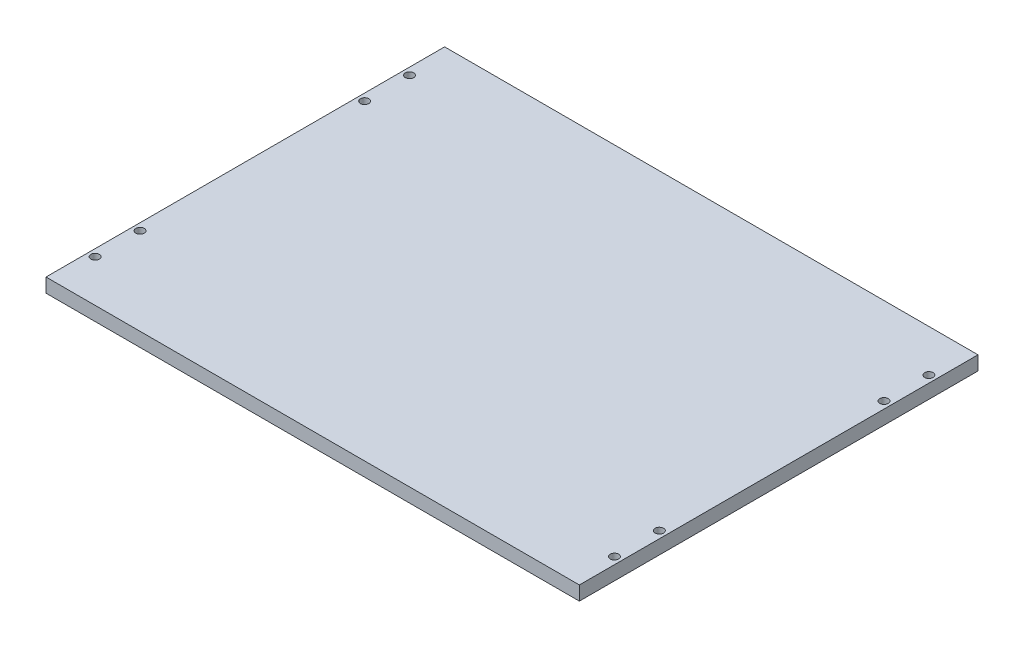
ISO-10303-21;
HEADER;
FILE_DESCRIPTION(('STEP AP214'),'2;1');
FILE_NAME('part.step','',(''),(''),'','','');
FILE_SCHEMA(('AUTOMOTIVE_DESIGN { 1 0 10303 214 1 1 1 1 }'));
ENDSEC;
DATA;
#1=APPLICATION_CONTEXT('core data for automotive mechanical design processes');
#2=APPLICATION_PROTOCOL_DEFINITION('international standard','automotive_design',2000,#1);
#3=PRODUCT_CONTEXT('',#1,'mechanical');
#4=PRODUCT('Part','Part','',(#3));
#5=PRODUCT_RELATED_PRODUCT_CATEGORY('part','',(#4));
#6=PRODUCT_DEFINITION_FORMATION('','',#4);
#7=PRODUCT_DEFINITION_CONTEXT('part definition',#1,'design');
#8=PRODUCT_DEFINITION('design','',#6,#7);
#9=PRODUCT_DEFINITION_SHAPE('','',#8);
#10=(LENGTH_UNIT() NAMED_UNIT(*) SI_UNIT(.MILLI.,.METRE.));
#11=(NAMED_UNIT(*) PLANE_ANGLE_UNIT() SI_UNIT($,.RADIAN.));
#12=(NAMED_UNIT(*) SI_UNIT($,.STERADIAN.) SOLID_ANGLE_UNIT());
#13=UNCERTAINTY_MEASURE_WITH_UNIT(LENGTH_MEASURE(1.E-05),#10,'distance_accuracy_value','');
#14=(GEOMETRIC_REPRESENTATION_CONTEXT(3) GLOBAL_UNCERTAINTY_ASSIGNED_CONTEXT((#13)) GLOBAL_UNIT_ASSIGNED_CONTEXT((#10,
#11,#12)) REPRESENTATION_CONTEXT('',''));
#15=CARTESIAN_POINT('',(0.,0.,0.));
#16=DIRECTION('',(0.,0.,1.));
#17=DIRECTION('',(1.,0.,0.));
#18=AXIS2_PLACEMENT_3D('',#15,#16,#17);
#19=CARTESIAN_POINT('',(0.,5.,0.));
#20=DIRECTION('',(0.,-1.,0.));
#21=DIRECTION('',(0.,0.,-1.));
#22=AXIS2_PLACEMENT_3D('',#19,#20,#21);
#23=PLANE('',#22);
#24=CARTESIAN_POINT('',(92.5,5.,-127.));
#25=DIRECTION('',(0.,1.,0.));
#26=DIRECTION('',(0.,0.,1.));
#27=AXIS2_PLACEMENT_3D('',#24,#25,#26);
#28=CIRCLE('',#27,1.5);
#29=CARTESIAN_POINT('',(92.5,5.,-125.5));
#30=VERTEX_POINT('',#29);
#31=EDGE_CURVE('E110',#30,#30,#28,.T.);
#32=ORIENTED_EDGE('',*,*,#31,.F.);
#33=EDGE_LOOP('',(#32));
#34=FACE_BOUND('',#33,.T.);
#35=CARTESIAN_POINT('',(92.5,5.,-15.));
#36=DIRECTION('',(0.,1.,0.));
#37=DIRECTION('',(0.,0.,1.));
#38=AXIS2_PLACEMENT_3D('',#35,#36,#37);
#39=CIRCLE('',#38,1.5);
#40=CARTESIAN_POINT('',(92.5,5.,-13.5));
#41=VERTEX_POINT('',#40);
#42=EDGE_CURVE('E82',#41,#41,#39,.T.);
#43=ORIENTED_EDGE('',*,*,#42,.F.);
#44=EDGE_LOOP('',(#43));
#45=FACE_BOUND('',#44,.T.);
#46=DIRECTION('',(-1.,0.,0.));
#47=VECTOR('',#46,1.);
#48=CARTESIAN_POINT('',(0.,5.,-142.));
#49=LINE('',#48,#47);
#50=CARTESIAN_POINT('',(95.,5.,-142.));
#51=VERTEX_POINT('',#50);
#52=CARTESIAN_POINT('',(-95.,5.,-142.));
#53=VERTEX_POINT('',#52);
#54=EDGE_CURVE('E129',#51,#53,#49,.T.);
#55=ORIENTED_EDGE('',*,*,#54,.T.);
#56=DIRECTION('',(0.,0.,-1.));
#57=VECTOR('',#56,1.);
#58=CARTESIAN_POINT('',(-95.,5.,0.));
#59=LINE('',#58,#57);
#60=CARTESIAN_POINT('',(-95.,5.,0.));
#61=VERTEX_POINT('',#60);
#62=EDGE_CURVE('E89',#61,#53,#59,.T.);
#63=ORIENTED_EDGE('',*,*,#62,.F.);
#64=DIRECTION('',(1.,0.,0.));
#65=VECTOR('',#64,1.);
#66=CARTESIAN_POINT('',(0.,5.,0.));
#67=LINE('',#66,#65);
#68=CARTESIAN_POINT('',(95.,5.,0.));
#69=VERTEX_POINT('',#68);
#70=EDGE_CURVE('E66',#61,#69,#67,.T.);
#71=ORIENTED_EDGE('',*,*,#70,.T.);
#72=DIRECTION('',(0.,0.,-1.));
#73=VECTOR('',#72,1.);
#74=CARTESIAN_POINT('',(95.,5.,0.));
#75=LINE('',#74,#73);
#76=EDGE_CURVE('E50',#69,#51,#75,.T.);
#77=ORIENTED_EDGE('',*,*,#76,.T.);
#78=EDGE_LOOP('',(#55,#63,#71,#77));
#79=FACE_BOUND('',#78,.T.);
#80=CARTESIAN_POINT('',(92.5,5.,-31.));
#81=DIRECTION('',(0.,1.,0.));
#82=DIRECTION('',(0.,0.,1.));
#83=AXIS2_PLACEMENT_3D('',#80,#81,#82);
#84=CIRCLE('',#83,1.5);
#85=CARTESIAN_POINT('',(92.5,5.,-29.5));
#86=VERTEX_POINT('',#85);
#87=EDGE_CURVE('E116',#86,#86,#84,.T.);
#88=ORIENTED_EDGE('',*,*,#87,.F.);
#89=EDGE_LOOP('',(#88));
#90=FACE_BOUND('',#89,.T.);
#91=CARTESIAN_POINT('',(92.5,5.,-111.));
#92=DIRECTION('',(0.,1.,0.));
#93=DIRECTION('',(0.,0.,1.));
#94=AXIS2_PLACEMENT_3D('',#91,#92,#93);
#95=CIRCLE('',#94,1.5);
#96=CARTESIAN_POINT('',(92.5,5.,-109.5));
#97=VERTEX_POINT('',#96);
#98=EDGE_CURVE('E104',#97,#97,#95,.T.);
#99=ORIENTED_EDGE('',*,*,#98,.F.);
#100=EDGE_LOOP('',(#99));
#101=FACE_BOUND('',#100,.T.);
#102=CARTESIAN_POINT('',(-92.5,5.,-111.));
#103=DIRECTION('',(0.,-1.,0.));
#104=DIRECTION('',(0.,0.,1.));
#105=AXIS2_PLACEMENT_3D('',#102,#103,#104);
#106=CIRCLE('',#105,1.5);
#107=CARTESIAN_POINT('',(-92.5,5.,-109.5));
#108=VERTEX_POINT('',#107);
#109=EDGE_CURVE('E193',#108,#108,#106,.T.);
#110=ORIENTED_EDGE('',*,*,#109,.T.);
#111=EDGE_LOOP('',(#110));
#112=FACE_BOUND('',#111,.T.);
#113=CARTESIAN_POINT('',(-92.5,5.,-127.));
#114=DIRECTION('',(0.,-1.,0.));
#115=DIRECTION('',(0.,0.,1.));
#116=AXIS2_PLACEMENT_3D('',#113,#114,#115);
#117=CIRCLE('',#116,1.5);
#118=CARTESIAN_POINT('',(-92.5,5.,-125.5));
#119=VERTEX_POINT('',#118);
#120=EDGE_CURVE('E202',#119,#119,#117,.T.);
#121=ORIENTED_EDGE('',*,*,#120,.T.);
#122=EDGE_LOOP('',(#121));
#123=FACE_BOUND('',#122,.T.);
#124=CARTESIAN_POINT('',(-92.5,5.,-31.));
#125=DIRECTION('',(0.,-1.,0.));
#126=DIRECTION('',(0.,0.,1.));
#127=AXIS2_PLACEMENT_3D('',#124,#125,#126);
#128=CIRCLE('',#127,1.5);
#129=CARTESIAN_POINT('',(-92.5,5.,-29.5));
#130=VERTEX_POINT('',#129);
#131=EDGE_CURVE('E208',#130,#130,#128,.T.);
#132=ORIENTED_EDGE('',*,*,#131,.T.);
#133=EDGE_LOOP('',(#132));
#134=FACE_BOUND('',#133,.T.);
#135=CARTESIAN_POINT('',(-92.5,5.,-15.));
#136=DIRECTION('',(0.,-1.,0.));
#137=DIRECTION('',(0.,0.,1.));
#138=AXIS2_PLACEMENT_3D('',#135,#136,#137);
#139=CIRCLE('',#138,1.5);
#140=CARTESIAN_POINT('',(-92.5,5.,-13.5));
#141=VERTEX_POINT('',#140);
#142=EDGE_CURVE('E94',#141,#141,#139,.T.);
#143=ORIENTED_EDGE('',*,*,#142,.T.);
#144=EDGE_LOOP('',(#143));
#145=FACE_BOUND('',#144,.T.);
#146=ADVANCED_FACE('F33',(#34,#45,#79,#90,#101,#112,#123,#134,#145),#23,.F.);
#147=CARTESIAN_POINT('',(0.,0.,0.));
#148=DIRECTION('',(0.,-1.,0.));
#149=DIRECTION('',(0.,0.,-1.));
#150=AXIS2_PLACEMENT_3D('',#147,#148,#149);
#151=PLANE('',#150);
#152=CARTESIAN_POINT('',(92.5,0.,-127.));
#153=DIRECTION('',(0.,1.,0.));
#154=DIRECTION('',(0.,0.,1.));
#155=AXIS2_PLACEMENT_3D('',#152,#153,#154);
#156=CIRCLE('',#155,1.5);
#157=CARTESIAN_POINT('',(92.5,0.,-125.5));
#158=VERTEX_POINT('',#157);
#159=EDGE_CURVE('E107',#158,#158,#156,.T.);
#160=ORIENTED_EDGE('',*,*,#159,.T.);
#161=EDGE_LOOP('',(#160));
#162=FACE_BOUND('',#161,.T.);
#163=CARTESIAN_POINT('',(92.5,0.,-15.));
#164=DIRECTION('',(0.,1.,0.));
#165=DIRECTION('',(0.,0.,1.));
#166=AXIS2_PLACEMENT_3D('',#163,#164,#165);
#167=CIRCLE('',#166,1.5);
#168=CARTESIAN_POINT('',(92.5,0.,-13.5));
#169=VERTEX_POINT('',#168);
#170=EDGE_CURVE('E119',#169,#169,#167,.T.);
#171=ORIENTED_EDGE('',*,*,#170,.T.);
#172=EDGE_LOOP('',(#171));
#173=FACE_BOUND('',#172,.T.);
#174=DIRECTION('',(1.,0.,0.));
#175=VECTOR('',#174,1.);
#176=CARTESIAN_POINT('',(0.,0.,0.));
#177=LINE('',#176,#175);
#178=CARTESIAN_POINT('',(-95.,0.,0.));
#179=VERTEX_POINT('',#178);
#180=CARTESIAN_POINT('',(95.,0.,0.));
#181=VERTEX_POINT('',#180);
#182=EDGE_CURVE('E61',#179,#181,#177,.T.);
#183=ORIENTED_EDGE('',*,*,#182,.F.);
#184=DIRECTION('',(0.,0.,-1.));
#185=VECTOR('',#184,1.);
#186=CARTESIAN_POINT('',(-95.,0.,0.));
#187=LINE('',#186,#185);
#188=CARTESIAN_POINT('',(-95.,0.,-142.));
#189=VERTEX_POINT('',#188);
#190=EDGE_CURVE('E80',#179,#189,#187,.T.);
#191=ORIENTED_EDGE('',*,*,#190,.T.);
#192=DIRECTION('',(-1.,0.,0.));
#193=VECTOR('',#192,1.);
#194=CARTESIAN_POINT('',(0.,0.,-142.));
#195=LINE('',#194,#193);
#196=CARTESIAN_POINT('',(95.,0.,-142.));
#197=VERTEX_POINT('',#196);
#198=EDGE_CURVE('E127',#197,#189,#195,.T.);
#199=ORIENTED_EDGE('',*,*,#198,.F.);
#200=DIRECTION('',(0.,0.,-1.));
#201=VECTOR('',#200,1.);
#202=CARTESIAN_POINT('',(95.,0.,0.));
#203=LINE('',#202,#201);
#204=EDGE_CURVE('E81',#181,#197,#203,.T.);
#205=ORIENTED_EDGE('',*,*,#204,.F.);
#206=EDGE_LOOP('',(#183,#191,#199,#205));
#207=FACE_BOUND('',#206,.T.);
#208=CARTESIAN_POINT('',(92.5,0.,-31.));
#209=DIRECTION('',(0.,1.,0.));
#210=DIRECTION('',(0.,0.,1.));
#211=AXIS2_PLACEMENT_3D('',#208,#209,#210);
#212=CIRCLE('',#211,1.5);
#213=CARTESIAN_POINT('',(92.5,0.,-29.5));
#214=VERTEX_POINT('',#213);
#215=EDGE_CURVE('E113',#214,#214,#212,.T.);
#216=ORIENTED_EDGE('',*,*,#215,.T.);
#217=EDGE_LOOP('',(#216));
#218=FACE_BOUND('',#217,.T.);
#219=CARTESIAN_POINT('',(92.5,0.,-111.));
#220=DIRECTION('',(0.,1.,0.));
#221=DIRECTION('',(0.,0.,1.));
#222=AXIS2_PLACEMENT_3D('',#219,#220,#221);
#223=CIRCLE('',#222,1.5);
#224=CARTESIAN_POINT('',(92.5,0.,-109.5));
#225=VERTEX_POINT('',#224);
#226=EDGE_CURVE('E103',#225,#225,#223,.T.);
#227=ORIENTED_EDGE('',*,*,#226,.T.);
#228=EDGE_LOOP('',(#227));
#229=FACE_BOUND('',#228,.T.);
#230=CARTESIAN_POINT('',(-92.5,0.,-111.));
#231=DIRECTION('',(0.,-1.,0.));
#232=DIRECTION('',(0.,0.,1.));
#233=AXIS2_PLACEMENT_3D('',#230,#231,#232);
#234=CIRCLE('',#233,1.5);
#235=CARTESIAN_POINT('',(-92.5,0.,-109.5));
#236=VERTEX_POINT('',#235);
#237=EDGE_CURVE('E196',#236,#236,#234,.T.);
#238=ORIENTED_EDGE('',*,*,#237,.F.);
#239=EDGE_LOOP('',(#238));
#240=FACE_BOUND('',#239,.T.);
#241=CARTESIAN_POINT('',(-92.5,0.,-127.));
#242=DIRECTION('',(0.,-1.,0.));
#243=DIRECTION('',(0.,0.,1.));
#244=AXIS2_PLACEMENT_3D('',#241,#242,#243);
#245=CIRCLE('',#244,1.5);
#246=CARTESIAN_POINT('',(-92.5,0.,-125.5));
#247=VERTEX_POINT('',#246);
#248=EDGE_CURVE('E199',#247,#247,#245,.T.);
#249=ORIENTED_EDGE('',*,*,#248,.F.);
#250=EDGE_LOOP('',(#249));
#251=FACE_BOUND('',#250,.T.);
#252=CARTESIAN_POINT('',(-92.5,0.,-31.));
#253=DIRECTION('',(0.,-1.,0.));
#254=DIRECTION('',(0.,0.,1.));
#255=AXIS2_PLACEMENT_3D('',#252,#253,#254);
#256=CIRCLE('',#255,1.5);
#257=CARTESIAN_POINT('',(-92.5,0.,-29.5));
#258=VERTEX_POINT('',#257);
#259=EDGE_CURVE('E205',#258,#258,#256,.T.);
#260=ORIENTED_EDGE('',*,*,#259,.F.);
#261=EDGE_LOOP('',(#260));
#262=FACE_BOUND('',#261,.T.);
#263=CARTESIAN_POINT('',(-92.5,0.,-15.));
#264=DIRECTION('',(0.,-1.,0.));
#265=DIRECTION('',(0.,0.,1.));
#266=AXIS2_PLACEMENT_3D('',#263,#264,#265);
#267=CIRCLE('',#266,1.5);
#268=CARTESIAN_POINT('',(-92.5,0.,-13.5));
#269=VERTEX_POINT('',#268);
#270=EDGE_CURVE('E98',#269,#269,#267,.T.);
#271=ORIENTED_EDGE('',*,*,#270,.F.);
#272=EDGE_LOOP('',(#271));
#273=FACE_BOUND('',#272,.T.);
#274=ADVANCED_FACE('F76',(#162,#173,#207,#218,#229,#240,#251,#262,#273),#151,.T.);
#275=CARTESIAN_POINT('',(0.,5.,0.));
#276=DIRECTION('',(0.,0.,-1.));
#277=DIRECTION('',(-1.,0.,0.));
#278=AXIS2_PLACEMENT_3D('',#275,#276,#277);
#279=PLANE('',#278);
#280=ORIENTED_EDGE('',*,*,#182,.T.);
#281=DIRECTION('',(0.,-1.,0.));
#282=VECTOR('',#281,1.);
#283=CARTESIAN_POINT('',(95.,5.,0.));
#284=LINE('',#283,#282);
#285=EDGE_CURVE('E11',#69,#181,#284,.T.);
#286=ORIENTED_EDGE('',*,*,#285,.F.);
#287=ORIENTED_EDGE('',*,*,#70,.F.);
#288=DIRECTION('',(0.,-1.,0.));
#289=VECTOR('',#288,1.);
#290=CARTESIAN_POINT('',(-95.,5.,0.));
#291=LINE('',#290,#289);
#292=EDGE_CURVE('E84',#61,#179,#291,.T.);
#293=ORIENTED_EDGE('',*,*,#292,.T.);
#294=EDGE_LOOP('',(#280,#286,#287,#293));
#295=FACE_BOUND('',#294,.T.);
#296=ADVANCED_FACE('F35',(#295),#279,.F.);
#297=CARTESIAN_POINT('',(95.,5.,0.));
#298=DIRECTION('',(-1.,0.,0.));
#299=DIRECTION('',(0.,0.,1.));
#300=AXIS2_PLACEMENT_3D('',#297,#298,#299);
#301=PLANE('',#300);
#302=ORIENTED_EDGE('',*,*,#204,.T.);
#303=DIRECTION('',(0.,-1.,0.));
#304=VECTOR('',#303,1.);
#305=CARTESIAN_POINT('',(95.,5.,-142.));
#306=LINE('',#305,#304);
#307=EDGE_CURVE('E42',#51,#197,#306,.T.);
#308=ORIENTED_EDGE('',*,*,#307,.F.);
#309=ORIENTED_EDGE('',*,*,#76,.F.);
#310=ORIENTED_EDGE('',*,*,#285,.T.);
#311=EDGE_LOOP('',(#302,#308,#309,#310));
#312=FACE_BOUND('',#311,.T.);
#313=ADVANCED_FACE('F137',(#312),#301,.F.);
#314=CARTESIAN_POINT('',(0.,5.,-142.));
#315=DIRECTION('',(0.,0.,1.));
#316=DIRECTION('',(1.,0.,0.));
#317=AXIS2_PLACEMENT_3D('',#314,#315,#316);
#318=PLANE('',#317);
#319=ORIENTED_EDGE('',*,*,#198,.T.);
#320=DIRECTION('',(0.,-1.,0.));
#321=VECTOR('',#320,1.);
#322=CARTESIAN_POINT('',(-95.,5.,-142.));
#323=LINE('',#322,#321);
#324=EDGE_CURVE('E88',#53,#189,#323,.T.);
#325=ORIENTED_EDGE('',*,*,#324,.F.);
#326=ORIENTED_EDGE('',*,*,#54,.F.);
#327=ORIENTED_EDGE('',*,*,#307,.T.);
#328=EDGE_LOOP('',(#319,#325,#326,#327));
#329=FACE_BOUND('',#328,.T.);
#330=ADVANCED_FACE('F135',(#329),#318,.F.);
#331=CARTESIAN_POINT('',(92.5,5.,-15.));
#332=DIRECTION('',(0.,-1.,0.));
#333=DIRECTION('',(0.,0.,-1.));
#334=AXIS2_PLACEMENT_3D('',#331,#332,#333);
#335=CYLINDRICAL_SURFACE('',#334,1.5);
#336=ORIENTED_EDGE('',*,*,#42,.T.);
#337=EDGE_LOOP('',(#336));
#338=FACE_BOUND('',#337,.T.);
#339=ORIENTED_EDGE('',*,*,#170,.F.);
#340=EDGE_LOOP('',(#339));
#341=FACE_BOUND('',#340,.T.);
#342=ADVANCED_FACE('F143',(#338,#341),#335,.F.);
#343=CARTESIAN_POINT('',(92.5,5.,-31.));
#344=DIRECTION('',(0.,-1.,0.));
#345=DIRECTION('',(0.,0.,-1.));
#346=AXIS2_PLACEMENT_3D('',#343,#344,#345);
#347=CYLINDRICAL_SURFACE('',#346,1.5);
#348=ORIENTED_EDGE('',*,*,#87,.T.);
#349=EDGE_LOOP('',(#348));
#350=FACE_BOUND('',#349,.T.);
#351=ORIENTED_EDGE('',*,*,#215,.F.);
#352=EDGE_LOOP('',(#351));
#353=FACE_BOUND('',#352,.T.);
#354=ADVANCED_FACE('F158',(#350,#353),#347,.F.);
#355=CARTESIAN_POINT('',(92.5,5.,-127.));
#356=DIRECTION('',(0.,-1.,0.));
#357=DIRECTION('',(0.,0.,-1.));
#358=AXIS2_PLACEMENT_3D('',#355,#356,#357);
#359=CYLINDRICAL_SURFACE('',#358,1.5);
#360=ORIENTED_EDGE('',*,*,#31,.T.);
#361=EDGE_LOOP('',(#360));
#362=FACE_BOUND('',#361,.T.);
#363=ORIENTED_EDGE('',*,*,#159,.F.);
#364=EDGE_LOOP('',(#363));
#365=FACE_BOUND('',#364,.T.);
#366=ADVANCED_FACE('F162',(#362,#365),#359,.F.);
#367=CARTESIAN_POINT('',(92.5,5.,-111.));
#368=DIRECTION('',(0.,-1.,0.));
#369=DIRECTION('',(0.,0.,-1.));
#370=AXIS2_PLACEMENT_3D('',#367,#368,#369);
#371=CYLINDRICAL_SURFACE('',#370,1.5);
#372=ORIENTED_EDGE('',*,*,#98,.T.);
#373=EDGE_LOOP('',(#372));
#374=FACE_BOUND('',#373,.T.);
#375=ORIENTED_EDGE('',*,*,#226,.F.);
#376=EDGE_LOOP('',(#375));
#377=FACE_BOUND('',#376,.T.);
#378=ADVANCED_FACE('F166',(#374,#377),#371,.F.);
#379=CARTESIAN_POINT('',(-95.,5.,0.));
#380=DIRECTION('',(-1.,0.,0.));
#381=DIRECTION('',(0.,0.,1.));
#382=AXIS2_PLACEMENT_3D('',#379,#380,#381);
#383=PLANE('',#382);
#384=ORIENTED_EDGE('',*,*,#190,.F.);
#385=ORIENTED_EDGE('',*,*,#292,.F.);
#386=ORIENTED_EDGE('',*,*,#62,.T.);
#387=ORIENTED_EDGE('',*,*,#324,.T.);
#388=EDGE_LOOP('',(#384,#385,#386,#387));
#389=FACE_BOUND('',#388,.T.);
#390=ADVANCED_FACE('F92',(#389),#383,.T.);
#391=CARTESIAN_POINT('',(-92.5,5.,-15.));
#392=DIRECTION('',(0.,-1.,0.));
#393=DIRECTION('',(0.,0.,-1.));
#394=AXIS2_PLACEMENT_3D('',#391,#392,#393);
#395=CYLINDRICAL_SURFACE('',#394,1.5);
#396=ORIENTED_EDGE('',*,*,#142,.F.);
#397=EDGE_LOOP('',(#396));
#398=FACE_BOUND('',#397,.T.);
#399=ORIENTED_EDGE('',*,*,#270,.T.);
#400=EDGE_LOOP('',(#399));
#401=FACE_BOUND('',#400,.T.);
#402=ADVANCED_FACE('F173',(#398,#401),#395,.F.);
#403=CARTESIAN_POINT('',(-92.5,5.,-31.));
#404=DIRECTION('',(0.,-1.,0.));
#405=DIRECTION('',(0.,0.,-1.));
#406=AXIS2_PLACEMENT_3D('',#403,#404,#405);
#407=CYLINDRICAL_SURFACE('',#406,1.5);
#408=ORIENTED_EDGE('',*,*,#131,.F.);
#409=EDGE_LOOP('',(#408));
#410=FACE_BOUND('',#409,.T.);
#411=ORIENTED_EDGE('',*,*,#259,.T.);
#412=EDGE_LOOP('',(#411));
#413=FACE_BOUND('',#412,.T.);
#414=ADVANCED_FACE('F176',(#410,#413),#407,.F.);
#415=CARTESIAN_POINT('',(-92.5,5.,-127.));
#416=DIRECTION('',(0.,-1.,0.));
#417=DIRECTION('',(0.,0.,-1.));
#418=AXIS2_PLACEMENT_3D('',#415,#416,#417);
#419=CYLINDRICAL_SURFACE('',#418,1.5);
#420=ORIENTED_EDGE('',*,*,#120,.F.);
#421=EDGE_LOOP('',(#420));
#422=FACE_BOUND('',#421,.T.);
#423=ORIENTED_EDGE('',*,*,#248,.T.);
#424=EDGE_LOOP('',(#423));
#425=FACE_BOUND('',#424,.T.);
#426=ADVANCED_FACE('F180',(#422,#425),#419,.F.);
#427=CARTESIAN_POINT('',(-92.5,5.,-111.));
#428=DIRECTION('',(0.,-1.,0.));
#429=DIRECTION('',(0.,0.,-1.));
#430=AXIS2_PLACEMENT_3D('',#427,#428,#429);
#431=CYLINDRICAL_SURFACE('',#430,1.5);
#432=ORIENTED_EDGE('',*,*,#109,.F.);
#433=EDGE_LOOP('',(#432));
#434=FACE_BOUND('',#433,.T.);
#435=ORIENTED_EDGE('',*,*,#237,.T.);
#436=EDGE_LOOP('',(#435));
#437=FACE_BOUND('',#436,.T.);
#438=ADVANCED_FACE('F184',(#434,#437),#431,.F.);
#439=CLOSED_SHELL('',(#146,#274,#296,#313,#330,#342,#354,#366,#378,#390,#402,#414,#426,#438));
#440=MANIFOLD_SOLID_BREP('B2',#439);
#441=ADVANCED_BREP_SHAPE_REPRESENTATION('',(#18,#440),#14);
#442=SHAPE_DEFINITION_REPRESENTATION(#9,#441);
ENDSEC;
END-ISO-10303-21;
